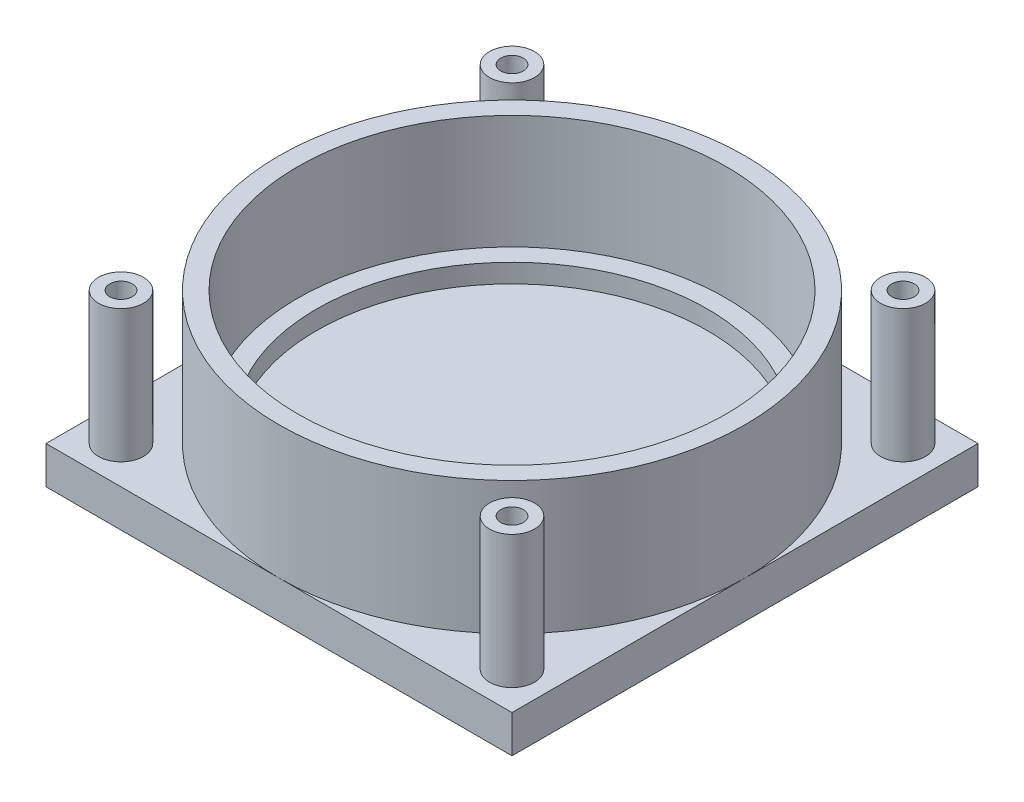
ISO-10303-21;
HEADER;
FILE_DESCRIPTION(('STEP AP214'),'2;1');
FILE_NAME('part.step','',(''),(''),'','','');
FILE_SCHEMA(('AUTOMOTIVE_DESIGN { 1 0 10303 214 1 1 1 1 }'));
ENDSEC;
DATA;
#1=APPLICATION_CONTEXT('core data for automotive mechanical design processes');
#2=APPLICATION_PROTOCOL_DEFINITION('international standard','automotive_design',2000,#1);
#3=PRODUCT_CONTEXT('',#1,'mechanical');
#4=PRODUCT('Part','Part','',(#3));
#5=PRODUCT_RELATED_PRODUCT_CATEGORY('part','',(#4));
#6=PRODUCT_DEFINITION_FORMATION('','',#4);
#7=PRODUCT_DEFINITION_CONTEXT('part definition',#1,'design');
#8=PRODUCT_DEFINITION('design','',#6,#7);
#9=PRODUCT_DEFINITION_SHAPE('','',#8);
#10=(LENGTH_UNIT() NAMED_UNIT(*) SI_UNIT(.MILLI.,.METRE.));
#11=(NAMED_UNIT(*) PLANE_ANGLE_UNIT() SI_UNIT($,.RADIAN.));
#12=(NAMED_UNIT(*) SI_UNIT($,.STERADIAN.) SOLID_ANGLE_UNIT());
#13=UNCERTAINTY_MEASURE_WITH_UNIT(LENGTH_MEASURE(1.E-05),#10,'distance_accuracy_value','');
#14=(GEOMETRIC_REPRESENTATION_CONTEXT(3) GLOBAL_UNCERTAINTY_ASSIGNED_CONTEXT((#13)) GLOBAL_UNIT_ASSIGNED_CONTEXT((#10,
#11,#12)) REPRESENTATION_CONTEXT('',''));
#15=CARTESIAN_POINT('',(0.,0.,0.));
#16=DIRECTION('',(0.,0.,1.));
#17=DIRECTION('',(1.,0.,0.));
#18=AXIS2_PLACEMENT_3D('',#15,#16,#17);
#19=CARTESIAN_POINT('',(0.,5.,0.));
#20=DIRECTION('',(0.,1.,0.));
#21=DIRECTION('',(0.,0.,1.));
#22=AXIS2_PLACEMENT_3D('',#19,#20,#21);
#23=PLANE('',#22);
#24=CARTESIAN_POINT('',(0.,5.,0.));
#25=DIRECTION('',(0.,1.,0.));
#26=DIRECTION('',(0.,0.,1.));
#27=AXIS2_PLACEMENT_3D('',#24,#25,#26);
#28=CIRCLE('',#27,31.075);
#29=CARTESIAN_POINT('',(31.075,5.,0.));
#30=VERTEX_POINT('',#29);
#31=CARTESIAN_POINT('',(0.,5.,-31.075));
#32=VERTEX_POINT('',#31);
#33=EDGE_CURVE('E44',#30,#32,#28,.T.);
#34=ORIENTED_EDGE('',*,*,#33,.F.);
#35=DIRECTION('',(0.,0.,-1.));
#36=VECTOR('',#35,1.);
#37=CARTESIAN_POINT('',(31.075,5.,-31.075));
#38=LINE('',#37,#36);
#39=CARTESIAN_POINT('',(31.075,5.,-31.075));
#40=VERTEX_POINT('',#39);
#41=EDGE_CURVE('E126',#30,#40,#38,.T.);
#42=ORIENTED_EDGE('',*,*,#41,.T.);
#43=DIRECTION('',(-1.,0.,0.));
#44=VECTOR('',#43,1.);
#45=CARTESIAN_POINT('',(-31.075,5.,-31.075));
#46=LINE('',#45,#44);
#47=EDGE_CURVE('E127',#40,#32,#46,.T.);
#48=ORIENTED_EDGE('',*,*,#47,.T.);
#49=EDGE_LOOP('',(#34,#42,#48));
#50=FACE_BOUND('',#49,.T.);
#51=CARTESIAN_POINT('',(26.075,5.,-26.075));
#52=DIRECTION('',(0.,1.,0.));
#53=DIRECTION('',(0.,0.,-1.));
#54=AXIS2_PLACEMENT_3D('',#51,#52,#53);
#55=CIRCLE('',#54,3.);
#56=CARTESIAN_POINT('',(26.075,5.,-29.075));
#57=VERTEX_POINT('',#56);
#58=EDGE_CURVE('E456',#57,#57,#55,.T.);
#59=ORIENTED_EDGE('',*,*,#58,.F.);
#60=EDGE_LOOP('',(#59));
#61=FACE_BOUND('',#60,.T.);
#62=ADVANCED_FACE('F36',(#50,#61),#23,.T.);
#63=CARTESIAN_POINT('',(0.,5.,31.075));
#64=VERTEX_POINT('',#63);
#65=EDGE_CURVE('E108',#64,#30,#28,.T.);
#66=ORIENTED_EDGE('',*,*,#65,.F.);
#67=DIRECTION('',(1.,0.,0.));
#68=VECTOR('',#67,1.);
#69=CARTESIAN_POINT('',(-31.075,5.,31.075));
#70=LINE('',#69,#68);
#71=CARTESIAN_POINT('',(31.075,5.,31.075));
#72=VERTEX_POINT('',#71);
#73=EDGE_CURVE('E97',#64,#72,#70,.T.);
#74=ORIENTED_EDGE('',*,*,#73,.T.);
#75=EDGE_CURVE('E111',#72,#30,#38,.T.);
#76=ORIENTED_EDGE('',*,*,#75,.T.);
#77=EDGE_LOOP('',(#66,#74,#76));
#78=FACE_BOUND('',#77,.T.);
#79=CARTESIAN_POINT('',(26.075,5.,26.075));
#80=DIRECTION('',(0.,1.,0.));
#81=DIRECTION('',(0.,0.,1.));
#82=AXIS2_PLACEMENT_3D('',#79,#80,#81);
#83=CIRCLE('',#82,3.);
#84=CARTESIAN_POINT('',(26.075,5.,29.075));
#85=VERTEX_POINT('',#84);
#86=EDGE_CURVE('E466',#85,#85,#83,.T.);
#87=ORIENTED_EDGE('',*,*,#86,.F.);
#88=EDGE_LOOP('',(#87));
#89=FACE_BOUND('',#88,.T.);
#90=ADVANCED_FACE('F109',(#78,#89),#23,.T.);
#91=CARTESIAN_POINT('',(-31.075,5.,0.));
#92=VERTEX_POINT('',#91);
#93=EDGE_CURVE('E51',#92,#64,#28,.T.);
#94=ORIENTED_EDGE('',*,*,#93,.F.);
#95=DIRECTION('',(0.,0.,1.));
#96=VECTOR('',#95,1.);
#97=CARTESIAN_POINT('',(-31.075,5.,-31.075));
#98=LINE('',#97,#96);
#99=CARTESIAN_POINT('',(-31.075,5.,31.075));
#100=VERTEX_POINT('',#99);
#101=EDGE_CURVE('E92',#92,#100,#98,.T.);
#102=ORIENTED_EDGE('',*,*,#101,.T.);
#103=EDGE_CURVE('E88',#100,#64,#70,.T.);
#104=ORIENTED_EDGE('',*,*,#103,.T.);
#105=EDGE_LOOP('',(#94,#102,#104));
#106=FACE_BOUND('',#105,.T.);
#107=CARTESIAN_POINT('',(-26.075,5.,26.075));
#108=DIRECTION('',(0.,1.,0.));
#109=DIRECTION('',(0.,0.,-1.));
#110=AXIS2_PLACEMENT_3D('',#107,#108,#109);
#111=CIRCLE('',#110,3.);
#112=CARTESIAN_POINT('',(-26.075,5.,23.075));
#113=VERTEX_POINT('',#112);
#114=EDGE_CURVE('E475',#113,#113,#111,.T.);
#115=ORIENTED_EDGE('',*,*,#114,.F.);
#116=EDGE_LOOP('',(#115));
#117=FACE_BOUND('',#116,.T.);
#118=ADVANCED_FACE('F90',(#106,#117),#23,.T.);
#119=EDGE_CURVE('E59',#32,#92,#28,.T.);
#120=ORIENTED_EDGE('',*,*,#119,.F.);
#121=CARTESIAN_POINT('',(-31.075,5.,-31.075));
#122=VERTEX_POINT('',#121);
#123=EDGE_CURVE('E125',#32,#122,#46,.T.);
#124=ORIENTED_EDGE('',*,*,#123,.T.);
#125=EDGE_CURVE('E106',#122,#92,#98,.T.);
#126=ORIENTED_EDGE('',*,*,#125,.T.);
#127=EDGE_LOOP('',(#120,#124,#126));
#128=FACE_BOUND('',#127,.T.);
#129=CARTESIAN_POINT('',(-26.075,5.,-26.075));
#130=DIRECTION('',(0.,1.,0.));
#131=DIRECTION('',(0.,0.,1.));
#132=AXIS2_PLACEMENT_3D('',#129,#130,#131);
#133=CIRCLE('',#132,3.);
#134=CARTESIAN_POINT('',(-26.075,5.,-23.075));
#135=VERTEX_POINT('',#134);
#136=EDGE_CURVE('E167',#135,#135,#133,.T.);
#137=ORIENTED_EDGE('',*,*,#136,.F.);
#138=EDGE_LOOP('',(#137));
#139=FACE_BOUND('',#138,.T.);
#140=ADVANCED_FACE('F161',(#128,#139),#23,.T.);
#141=CARTESIAN_POINT('',(31.075,5.,-31.075));
#142=DIRECTION('',(-1.,0.,0.));
#143=DIRECTION('',(0.,0.,1.));
#144=AXIS2_PLACEMENT_3D('',#141,#142,#143);
#145=PLANE('',#144);
#146=DIRECTION('',(0.,0.,-1.));
#147=VECTOR('',#146,1.);
#148=CARTESIAN_POINT('',(31.075,0.,-31.075));
#149=LINE('',#148,#147);
#150=CARTESIAN_POINT('',(31.075,0.,31.075));
#151=VERTEX_POINT('',#150);
#152=CARTESIAN_POINT('',(31.075,0.,-31.075));
#153=VERTEX_POINT('',#152);
#154=EDGE_CURVE('E131',#151,#153,#149,.T.);
#155=ORIENTED_EDGE('',*,*,#154,.T.);
#156=DIRECTION('',(0.,-1.,0.));
#157=VECTOR('',#156,1.);
#158=CARTESIAN_POINT('',(31.075,5.,-31.075));
#159=LINE('',#158,#157);
#160=EDGE_CURVE('E118',#40,#153,#159,.T.);
#161=ORIENTED_EDGE('',*,*,#160,.F.);
#162=ORIENTED_EDGE('',*,*,#41,.F.);
#163=ORIENTED_EDGE('',*,*,#75,.F.);
#164=DIRECTION('',(0.,-1.,0.));
#165=VECTOR('',#164,1.);
#166=CARTESIAN_POINT('',(31.075,5.,31.075));
#167=LINE('',#166,#165);
#168=EDGE_CURVE('E96',#72,#151,#167,.T.);
#169=ORIENTED_EDGE('',*,*,#168,.T.);
#170=EDGE_LOOP('',(#155,#161,#162,#163,#169));
#171=FACE_BOUND('',#170,.T.);
#172=ADVANCED_FACE('F38',(#171),#145,.F.);
#173=CARTESIAN_POINT('',(-31.075,5.,-31.075));
#174=DIRECTION('',(0.,0.,1.));
#175=DIRECTION('',(1.,0.,0.));
#176=AXIS2_PLACEMENT_3D('',#173,#174,#175);
#177=PLANE('',#176);
#178=DIRECTION('',(-1.,0.,0.));
#179=VECTOR('',#178,1.);
#180=CARTESIAN_POINT('',(-31.075,0.,-31.075));
#181=LINE('',#180,#179);
#182=CARTESIAN_POINT('',(-31.075,0.,-31.075));
#183=VERTEX_POINT('',#182);
#184=EDGE_CURVE('E134',#153,#183,#181,.T.);
#185=ORIENTED_EDGE('',*,*,#184,.T.);
#186=DIRECTION('',(0.,-1.,0.));
#187=VECTOR('',#186,1.);
#188=CARTESIAN_POINT('',(-31.075,5.,-31.075));
#189=LINE('',#188,#187);
#190=EDGE_CURVE('E120',#122,#183,#189,.T.);
#191=ORIENTED_EDGE('',*,*,#190,.F.);
#192=ORIENTED_EDGE('',*,*,#123,.F.);
#193=ORIENTED_EDGE('',*,*,#47,.F.);
#194=ORIENTED_EDGE('',*,*,#160,.T.);
#195=EDGE_LOOP('',(#185,#191,#192,#193,#194));
#196=FACE_BOUND('',#195,.T.);
#197=ADVANCED_FACE('F160',(#196),#177,.F.);
#198=CARTESIAN_POINT('',(-31.075,5.,-31.075));
#199=DIRECTION('',(1.,0.,0.));
#200=DIRECTION('',(0.,0.,-1.));
#201=AXIS2_PLACEMENT_3D('',#198,#199,#200);
#202=PLANE('',#201);
#203=DIRECTION('',(0.,0.,1.));
#204=VECTOR('',#203,1.);
#205=CARTESIAN_POINT('',(-31.075,0.,-31.075));
#206=LINE('',#205,#204);
#207=CARTESIAN_POINT('',(-31.075,0.,31.075));
#208=VERTEX_POINT('',#207);
#209=EDGE_CURVE('E136',#183,#208,#206,.T.);
#210=ORIENTED_EDGE('',*,*,#209,.T.);
#211=DIRECTION('',(0.,-1.,0.));
#212=VECTOR('',#211,1.);
#213=CARTESIAN_POINT('',(-31.075,5.,31.075));
#214=LINE('',#213,#212);
#215=EDGE_CURVE('E141',#100,#208,#214,.T.);
#216=ORIENTED_EDGE('',*,*,#215,.F.);
#217=ORIENTED_EDGE('',*,*,#101,.F.);
#218=ORIENTED_EDGE('',*,*,#125,.F.);
#219=ORIENTED_EDGE('',*,*,#190,.T.);
#220=EDGE_LOOP('',(#210,#216,#217,#218,#219));
#221=FACE_BOUND('',#220,.T.);
#222=ADVANCED_FACE('F148',(#221),#202,.F.);
#223=CARTESIAN_POINT('',(-31.075,5.,31.075));
#224=DIRECTION('',(0.,0.,-1.));
#225=DIRECTION('',(-1.,0.,0.));
#226=AXIS2_PLACEMENT_3D('',#223,#224,#225);
#227=PLANE('',#226);
#228=DIRECTION('',(1.,0.,0.));
#229=VECTOR('',#228,1.);
#230=CARTESIAN_POINT('',(-31.075,0.,31.075));
#231=LINE('',#230,#229);
#232=EDGE_CURVE('E138',#208,#151,#231,.T.);
#233=ORIENTED_EDGE('',*,*,#232,.T.);
#234=ORIENTED_EDGE('',*,*,#168,.F.);
#235=ORIENTED_EDGE('',*,*,#73,.F.);
#236=ORIENTED_EDGE('',*,*,#103,.F.);
#237=ORIENTED_EDGE('',*,*,#215,.T.);
#238=EDGE_LOOP('',(#233,#234,#235,#236,#237));
#239=FACE_BOUND('',#238,.T.);
#240=ADVANCED_FACE('F101',(#239),#227,.F.);
#241=CARTESIAN_POINT('',(0.,0.,0.));
#242=DIRECTION('',(0.,1.,0.));
#243=DIRECTION('',(0.,0.,1.));
#244=AXIS2_PLACEMENT_3D('',#241,#242,#243);
#245=PLANE('',#244);
#246=CARTESIAN_POINT('',(26.075,0.,-26.075));
#247=DIRECTION('',(0.,1.,0.));
#248=DIRECTION('',(0.,0.,1.));
#249=AXIS2_PLACEMENT_3D('',#246,#247,#248);
#250=CIRCLE('',#249,1.5);
#251=CARTESIAN_POINT('',(26.075,0.,-24.575));
#252=VERTEX_POINT('',#251);
#253=EDGE_CURVE('E173',#252,#252,#250,.F.);
#254=ORIENTED_EDGE('',*,*,#253,.F.);
#255=EDGE_LOOP('',(#254));
#256=FACE_BOUND('',#255,.T.);
#257=CARTESIAN_POINT('',(26.075,0.,26.075));
#258=DIRECTION('',(0.,1.,0.));
#259=DIRECTION('',(0.,0.,1.));
#260=AXIS2_PLACEMENT_3D('',#257,#258,#259);
#261=CIRCLE('',#260,1.5);
#262=CARTESIAN_POINT('',(26.075,0.,27.575));
#263=VERTEX_POINT('',#262);
#264=EDGE_CURVE('E183',#263,#263,#261,.F.);
#265=ORIENTED_EDGE('',*,*,#264,.F.);
#266=EDGE_LOOP('',(#265));
#267=FACE_BOUND('',#266,.T.);
#268=CARTESIAN_POINT('',(-26.075,0.,26.075));
#269=DIRECTION('',(0.,1.,0.));
#270=DIRECTION('',(0.,0.,1.));
#271=AXIS2_PLACEMENT_3D('',#268,#269,#270);
#272=CIRCLE('',#271,1.5);
#273=CARTESIAN_POINT('',(-26.075,0.,27.575));
#274=VERTEX_POINT('',#273);
#275=EDGE_CURVE('E179',#274,#274,#272,.F.);
#276=ORIENTED_EDGE('',*,*,#275,.F.);
#277=EDGE_LOOP('',(#276));
#278=FACE_BOUND('',#277,.T.);
#279=CARTESIAN_POINT('',(-26.075,0.,-26.075));
#280=DIRECTION('',(0.,1.,0.));
#281=DIRECTION('',(0.,0.,1.));
#282=AXIS2_PLACEMENT_3D('',#279,#280,#281);
#283=CIRCLE('',#282,1.5);
#284=CARTESIAN_POINT('',(-26.075,0.,-24.575));
#285=VERTEX_POINT('',#284);
#286=EDGE_CURVE('E182',#285,#285,#283,.F.);
#287=ORIENTED_EDGE('',*,*,#286,.F.);
#288=EDGE_LOOP('',(#287));
#289=FACE_BOUND('',#288,.T.);
#290=ORIENTED_EDGE('',*,*,#154,.F.);
#291=ORIENTED_EDGE('',*,*,#232,.F.);
#292=ORIENTED_EDGE('',*,*,#209,.F.);
#293=ORIENTED_EDGE('',*,*,#184,.F.);
#294=EDGE_LOOP('',(#290,#291,#292,#293));
#295=FACE_BOUND('',#294,.T.);
#296=ADVANCED_FACE('F153',(#256,#267,#278,#289,#295),#245,.F.);
#297=CARTESIAN_POINT('',(0.,22.7,0.));
#298=DIRECTION('',(0.,-1.,0.));
#299=DIRECTION('',(0.,0.,-1.));
#300=AXIS2_PLACEMENT_3D('',#297,#298,#299);
#301=CYLINDRICAL_SURFACE('',#300,31.075);
#302=CARTESIAN_POINT('',(0.,22.7,0.));
#303=DIRECTION('',(0.,1.,0.));
#304=DIRECTION('',(0.,0.,1.));
#305=AXIS2_PLACEMENT_3D('',#302,#303,#304);
#306=CIRCLE('',#305,31.075);
#307=CARTESIAN_POINT('',(0.,22.7,31.075));
#308=VERTEX_POINT('',#307);
#309=EDGE_CURVE('E114',#308,#308,#306,.T.);
#310=ORIENTED_EDGE('',*,*,#309,.F.);
#311=EDGE_LOOP('',(#310));
#312=FACE_BOUND('',#311,.T.);
#313=ORIENTED_EDGE('',*,*,#65,.T.);
#314=ORIENTED_EDGE('',*,*,#33,.T.);
#315=ORIENTED_EDGE('',*,*,#119,.T.);
#316=ORIENTED_EDGE('',*,*,#93,.T.);
#317=EDGE_LOOP('',(#313,#314,#315,#316));
#318=FACE_BOUND('',#317,.T.);
#319=ADVANCED_FACE('F117',(#312,#318),#301,.T.);
#320=CARTESIAN_POINT('',(0.,22.7,0.));
#321=DIRECTION('',(0.,1.,0.));
#322=DIRECTION('',(0.,0.,1.));
#323=AXIS2_PLACEMENT_3D('',#320,#321,#322);
#324=PLANE('',#323);
#325=CARTESIAN_POINT('',(0.,22.7,0.));
#326=DIRECTION('',(0.,1.,0.));
#327=DIRECTION('',(0.,0.,1.));
#328=AXIS2_PLACEMENT_3D('',#325,#326,#327);
#329=CIRCLE('',#328,28.575);
#330=CARTESIAN_POINT('',(0.,22.7,28.575));
#331=VERTEX_POINT('',#330);
#332=EDGE_CURVE('E115',#331,#331,#329,.T.);
#333=ORIENTED_EDGE('',*,*,#332,.F.);
#334=EDGE_LOOP('',(#333));
#335=FACE_BOUND('',#334,.T.);
#336=ORIENTED_EDGE('',*,*,#309,.T.);
#337=EDGE_LOOP('',(#336));
#338=FACE_BOUND('',#337,.T.);
#339=ADVANCED_FACE('F200',(#335,#338),#324,.T.);
#340=CARTESIAN_POINT('',(0.,5.,0.));
#341=DIRECTION('',(0.,1.,0.));
#342=DIRECTION('',(0.,0.,1.));
#343=AXIS2_PLACEMENT_3D('',#340,#341,#342);
#344=CYLINDRICAL_SURFACE('',#343,28.575);
#345=CARTESIAN_POINT('',(0.,7.5,0.));
#346=DIRECTION('',(0.,1.,0.));
#347=DIRECTION('',(0.,0.,1.));
#348=AXIS2_PLACEMENT_3D('',#345,#346,#347);
#349=CIRCLE('',#348,28.575);
#350=CARTESIAN_POINT('',(0.,7.5,28.575));
#351=VERTEX_POINT('',#350);
#352=EDGE_CURVE('E193',#351,#351,#349,.T.);
#353=ORIENTED_EDGE('',*,*,#352,.F.);
#354=EDGE_LOOP('',(#353));
#355=FACE_BOUND('',#354,.T.);
#356=ORIENTED_EDGE('',*,*,#332,.T.);
#357=EDGE_LOOP('',(#356));
#358=FACE_BOUND('',#357,.T.);
#359=ADVANCED_FACE('F198',(#355,#358),#344,.F.);
#360=CARTESIAN_POINT('',(0.,7.5,0.));
#361=DIRECTION('',(0.,1.,0.));
#362=DIRECTION('',(0.,0.,1.));
#363=AXIS2_PLACEMENT_3D('',#360,#361,#362);
#364=PLANE('',#363);
#365=ORIENTED_EDGE('',*,*,#352,.T.);
#366=EDGE_LOOP('',(#365));
#367=FACE_BOUND('',#366,.T.);
#368=CARTESIAN_POINT('',(0.,7.5,0.));
#369=DIRECTION('',(0.,1.,0.));
#370=DIRECTION('',(0.,0.,1.));
#371=AXIS2_PLACEMENT_3D('',#368,#369,#370);
#372=CIRCLE('',#371,26.075);
#373=CARTESIAN_POINT('',(0.,7.5,26.075));
#374=VERTEX_POINT('',#373);
#375=EDGE_CURVE('E190',#374,#374,#372,.T.);
#376=ORIENTED_EDGE('',*,*,#375,.F.);
#377=EDGE_LOOP('',(#376));
#378=FACE_BOUND('',#377,.T.);
#379=ADVANCED_FACE('F328',(#367,#378),#364,.T.);
#380=CARTESIAN_POINT('',(0.,7.5,0.));
#381=DIRECTION('',(0.,-1.,0.));
#382=DIRECTION('',(0.,0.,-1.));
#383=AXIS2_PLACEMENT_3D('',#380,#381,#382);
#384=CYLINDRICAL_SURFACE('',#383,26.075);
#385=ORIENTED_EDGE('',*,*,#375,.T.);
#386=EDGE_LOOP('',(#385));
#387=FACE_BOUND('',#386,.T.);
#388=CARTESIAN_POINT('',(0.,5.,0.));
#389=DIRECTION('',(0.,1.,0.));
#390=DIRECTION('',(0.,0.,1.));
#391=AXIS2_PLACEMENT_3D('',#388,#389,#390);
#392=CIRCLE('',#391,26.075);
#393=CARTESIAN_POINT('',(0.,5.,26.075));
#394=VERTEX_POINT('',#393);
#395=EDGE_CURVE('E11',#394,#394,#392,.F.);
#396=ORIENTED_EDGE('',*,*,#395,.T.);
#397=EDGE_LOOP('',(#396));
#398=FACE_BOUND('',#397,.T.);
#399=ADVANCED_FACE('F323',(#387,#398),#384,.F.);
#400=CARTESIAN_POINT('',(0.,5.,0.));
#401=DIRECTION('',(0.,1.,0.));
#402=DIRECTION('',(0.,0.,1.));
#403=AXIS2_PLACEMENT_3D('',#400,#401,#402);
#404=PLANE('',#403);
#405=ORIENTED_EDGE('',*,*,#395,.F.);
#406=EDGE_LOOP('',(#405));
#407=FACE_BOUND('',#406,.T.);
#408=ADVANCED_FACE('F260',(#407),#404,.T.);
#409=CARTESIAN_POINT('',(-26.075,-0.00100000000000013,-26.075));
#410=DIRECTION('',(0.,1.,0.));
#411=DIRECTION('',(0.,0.,1.));
#412=AXIS2_PLACEMENT_3D('',#409,#410,#411);
#413=CYLINDRICAL_SURFACE('',#412,1.5);
#414=ORIENTED_EDGE('',*,*,#286,.T.);
#415=EDGE_LOOP('',(#414));
#416=FACE_BOUND('',#415,.T.);
#417=CARTESIAN_POINT('',(-26.075,22.7,-26.075));
#418=DIRECTION('',(0.,1.,0.));
#419=DIRECTION('',(0.,0.,1.));
#420=AXIS2_PLACEMENT_3D('',#417,#418,#419);
#421=CIRCLE('',#420,1.5);
#422=CARTESIAN_POINT('',(-26.075,22.7,-24.575));
#423=VERTEX_POINT('',#422);
#424=EDGE_CURVE('E170',#423,#423,#421,.T.);
#425=ORIENTED_EDGE('',*,*,#424,.T.);
#426=EDGE_LOOP('',(#425));
#427=FACE_BOUND('',#426,.T.);
#428=ADVANCED_FACE('F309',(#416,#427),#413,.F.);
#429=CARTESIAN_POINT('',(-26.075,-0.00100000000000013,26.075));
#430=DIRECTION('',(0.,1.,0.));
#431=DIRECTION('',(0.,0.,1.));
#432=AXIS2_PLACEMENT_3D('',#429,#430,#431);
#433=CYLINDRICAL_SURFACE('',#432,1.5);
#434=ORIENTED_EDGE('',*,*,#275,.T.);
#435=EDGE_LOOP('',(#434));
#436=FACE_BOUND('',#435,.T.);
#437=CARTESIAN_POINT('',(-26.075,22.7,26.075));
#438=DIRECTION('',(0.,1.,0.));
#439=DIRECTION('',(0.,0.,-1.));
#440=AXIS2_PLACEMENT_3D('',#437,#438,#439);
#441=CIRCLE('',#440,1.5);
#442=CARTESIAN_POINT('',(-26.075,22.7,24.575));
#443=VERTEX_POINT('',#442);
#444=EDGE_CURVE('E470',#443,#443,#441,.T.);
#445=ORIENTED_EDGE('',*,*,#444,.T.);
#446=EDGE_LOOP('',(#445));
#447=FACE_BOUND('',#446,.T.);
#448=ADVANCED_FACE('F298',(#436,#447),#433,.F.);
#449=CARTESIAN_POINT('',(26.075,-0.00100000000000013,26.075));
#450=DIRECTION('',(0.,1.,0.));
#451=DIRECTION('',(0.,0.,1.));
#452=AXIS2_PLACEMENT_3D('',#449,#450,#451);
#453=CYLINDRICAL_SURFACE('',#452,1.5);
#454=ORIENTED_EDGE('',*,*,#264,.T.);
#455=EDGE_LOOP('',(#454));
#456=FACE_BOUND('',#455,.T.);
#457=CARTESIAN_POINT('',(26.075,22.7,26.075));
#458=DIRECTION('',(0.,1.,0.));
#459=DIRECTION('',(0.,0.,1.));
#460=AXIS2_PLACEMENT_3D('',#457,#458,#459);
#461=CIRCLE('',#460,1.5);
#462=CARTESIAN_POINT('',(26.075,22.7,27.575));
#463=VERTEX_POINT('',#462);
#464=EDGE_CURVE('E459',#463,#463,#461,.T.);
#465=ORIENTED_EDGE('',*,*,#464,.T.);
#466=EDGE_LOOP('',(#465));
#467=FACE_BOUND('',#466,.T.);
#468=ADVANCED_FACE('F286',(#456,#467),#453,.F.);
#469=CARTESIAN_POINT('',(26.075,-0.00100000000000013,-26.075));
#470=DIRECTION('',(0.,1.,0.));
#471=DIRECTION('',(0.,0.,1.));
#472=AXIS2_PLACEMENT_3D('',#469,#470,#471);
#473=CYLINDRICAL_SURFACE('',#472,1.5);
#474=ORIENTED_EDGE('',*,*,#253,.T.);
#475=EDGE_LOOP('',(#474));
#476=FACE_BOUND('',#475,.T.);
#477=CARTESIAN_POINT('',(26.075,22.7,-26.075));
#478=DIRECTION('',(0.,1.,0.));
#479=DIRECTION('',(0.,0.,-1.));
#480=AXIS2_PLACEMENT_3D('',#477,#478,#479);
#481=CIRCLE('',#480,1.5);
#482=CARTESIAN_POINT('',(26.075,22.7,-27.575));
#483=VERTEX_POINT('',#482);
#484=EDGE_CURVE('E457',#483,#483,#481,.T.);
#485=ORIENTED_EDGE('',*,*,#484,.T.);
#486=EDGE_LOOP('',(#485));
#487=FACE_BOUND('',#486,.T.);
#488=ADVANCED_FACE('F279',(#476,#487),#473,.F.);
#489=CARTESIAN_POINT('',(-26.075,22.7,-26.075));
#490=DIRECTION('',(0.,1.,0.));
#491=DIRECTION('',(0.,0.,1.));
#492=AXIS2_PLACEMENT_3D('',#489,#490,#491);
#493=PLANE('',#492);
#494=CARTESIAN_POINT('',(-26.075,22.7,-26.075));
#495=DIRECTION('',(0.,1.,0.));
#496=DIRECTION('',(0.,0.,1.));
#497=AXIS2_PLACEMENT_3D('',#494,#495,#496);
#498=CIRCLE('',#497,3.);
#499=CARTESIAN_POINT('',(-26.075,22.7,-23.075));
#500=VERTEX_POINT('',#499);
#501=EDGE_CURVE('E169',#500,#500,#498,.T.);
#502=ORIENTED_EDGE('',*,*,#501,.T.);
#503=EDGE_LOOP('',(#502));
#504=FACE_BOUND('',#503,.T.);
#505=ORIENTED_EDGE('',*,*,#424,.F.);
#506=EDGE_LOOP('',(#505));
#507=FACE_BOUND('',#506,.T.);
#508=ADVANCED_FACE('F285',(#504,#507),#493,.T.);
#509=CARTESIAN_POINT('',(-26.075,22.7,-26.075));
#510=DIRECTION('',(0.,-1.,0.));
#511=DIRECTION('',(0.,0.,-1.));
#512=AXIS2_PLACEMENT_3D('',#509,#510,#511);
#513=CYLINDRICAL_SURFACE('',#512,3.);
#514=ORIENTED_EDGE('',*,*,#501,.F.);
#515=EDGE_LOOP('',(#514));
#516=FACE_BOUND('',#515,.T.);
#517=ORIENTED_EDGE('',*,*,#136,.T.);
#518=EDGE_LOOP('',(#517));
#519=FACE_BOUND('',#518,.T.);
#520=ADVANCED_FACE('F376',(#516,#519),#513,.T.);
#521=CARTESIAN_POINT('',(-26.075,22.7,26.075));
#522=DIRECTION('',(0.,-1.,0.));
#523=DIRECTION('',(0.,0.,-1.));
#524=AXIS2_PLACEMENT_3D('',#521,#522,#523);
#525=PLANE('',#524);
#526=CARTESIAN_POINT('',(-26.075,22.7,26.075));
#527=DIRECTION('',(0.,1.,0.));
#528=DIRECTION('',(0.,0.,-1.));
#529=AXIS2_PLACEMENT_3D('',#526,#527,#528);
#530=CIRCLE('',#529,3.);
#531=CARTESIAN_POINT('',(-26.075,22.7,23.075));
#532=VERTEX_POINT('',#531);
#533=EDGE_CURVE('E176',#532,#532,#530,.T.);
#534=ORIENTED_EDGE('',*,*,#533,.T.);
#535=EDGE_LOOP('',(#534));
#536=FACE_BOUND('',#535,.T.);
#537=ORIENTED_EDGE('',*,*,#444,.F.);
#538=EDGE_LOOP('',(#537));
#539=FACE_BOUND('',#538,.T.);
#540=ADVANCED_FACE('F383',(#536,#539),#525,.F.);
#541=CARTESIAN_POINT('',(-26.075,22.7,26.075));
#542=DIRECTION('',(0.,-1.,0.));
#543=DIRECTION('',(0.,0.,-1.));
#544=AXIS2_PLACEMENT_3D('',#541,#542,#543);
#545=CYLINDRICAL_SURFACE('',#544,3.);
#546=ORIENTED_EDGE('',*,*,#533,.F.);
#547=EDGE_LOOP('',(#546));
#548=FACE_BOUND('',#547,.T.);
#549=ORIENTED_EDGE('',*,*,#114,.T.);
#550=EDGE_LOOP('',(#549));
#551=FACE_BOUND('',#550,.T.);
#552=ADVANCED_FACE('F391',(#548,#551),#545,.T.);
#553=CARTESIAN_POINT('',(26.075,22.7,26.075));
#554=DIRECTION('',(0.,1.,0.));
#555=DIRECTION('',(0.,0.,1.));
#556=AXIS2_PLACEMENT_3D('',#553,#554,#555);
#557=PLANE('',#556);
#558=CARTESIAN_POINT('',(26.075,22.7,26.075));
#559=DIRECTION('',(0.,1.,0.));
#560=DIRECTION('',(0.,0.,1.));
#561=AXIS2_PLACEMENT_3D('',#558,#559,#560);
#562=CIRCLE('',#561,3.);
#563=CARTESIAN_POINT('',(26.075,22.7,29.075));
#564=VERTEX_POINT('',#563);
#565=EDGE_CURVE('E467',#564,#564,#562,.T.);
#566=ORIENTED_EDGE('',*,*,#565,.T.);
#567=EDGE_LOOP('',(#566));
#568=FACE_BOUND('',#567,.T.);
#569=ORIENTED_EDGE('',*,*,#464,.F.);
#570=EDGE_LOOP('',(#569));
#571=FACE_BOUND('',#570,.T.);
#572=ADVANCED_FACE('F399',(#568,#571),#557,.T.);
#573=CARTESIAN_POINT('',(26.075,22.7,26.075));
#574=DIRECTION('',(0.,-1.,0.));
#575=DIRECTION('',(0.,0.,-1.));
#576=AXIS2_PLACEMENT_3D('',#573,#574,#575);
#577=CYLINDRICAL_SURFACE('',#576,3.);
#578=ORIENTED_EDGE('',*,*,#565,.F.);
#579=EDGE_LOOP('',(#578));
#580=FACE_BOUND('',#579,.T.);
#581=ORIENTED_EDGE('',*,*,#86,.T.);
#582=EDGE_LOOP('',(#581));
#583=FACE_BOUND('',#582,.T.);
#584=ADVANCED_FACE('F407',(#580,#583),#577,.T.);
#585=CARTESIAN_POINT('',(26.075,22.7,-26.075));
#586=DIRECTION('',(0.,-1.,0.));
#587=DIRECTION('',(0.,0.,-1.));
#588=AXIS2_PLACEMENT_3D('',#585,#586,#587);
#589=PLANE('',#588);
#590=CARTESIAN_POINT('',(26.075,22.7,-26.075));
#591=DIRECTION('',(0.,1.,0.));
#592=DIRECTION('',(0.,0.,-1.));
#593=AXIS2_PLACEMENT_3D('',#590,#591,#592);
#594=CIRCLE('',#593,3.);
#595=CARTESIAN_POINT('',(26.075,22.7,-29.075));
#596=VERTEX_POINT('',#595);
#597=EDGE_CURVE('E453',#596,#596,#594,.T.);
#598=ORIENTED_EDGE('',*,*,#597,.T.);
#599=EDGE_LOOP('',(#598));
#600=FACE_BOUND('',#599,.T.);
#601=ORIENTED_EDGE('',*,*,#484,.F.);
#602=EDGE_LOOP('',(#601));
#603=FACE_BOUND('',#602,.T.);
#604=ADVANCED_FACE('F415',(#600,#603),#589,.F.);
#605=CARTESIAN_POINT('',(26.075,22.7,-26.075));
#606=DIRECTION('',(0.,-1.,0.));
#607=DIRECTION('',(0.,0.,-1.));
#608=AXIS2_PLACEMENT_3D('',#605,#606,#607);
#609=CYLINDRICAL_SURFACE('',#608,3.);
#610=ORIENTED_EDGE('',*,*,#597,.F.);
#611=EDGE_LOOP('',(#610));
#612=FACE_BOUND('',#611,.T.);
#613=ORIENTED_EDGE('',*,*,#58,.T.);
#614=EDGE_LOOP('',(#613));
#615=FACE_BOUND('',#614,.T.);
#616=ADVANCED_FACE('F423',(#612,#615),#609,.T.);
#617=CLOSED_SHELL('',(#62,#90,#118,#140,#172,#197,#222,#240,#296,#319,#339,#359,#379,#399,#408,
#428,#448,#468,#488,#508,#520,#540,#552,#572,#584,#604,#616));
#618=MANIFOLD_SOLID_BREP('B2',#617);
#619=ADVANCED_BREP_SHAPE_REPRESENTATION('',(#18,#618),#14);
#620=SHAPE_DEFINITION_REPRESENTATION(#9,#619);
ENDSEC;
END-ISO-10303-21;
